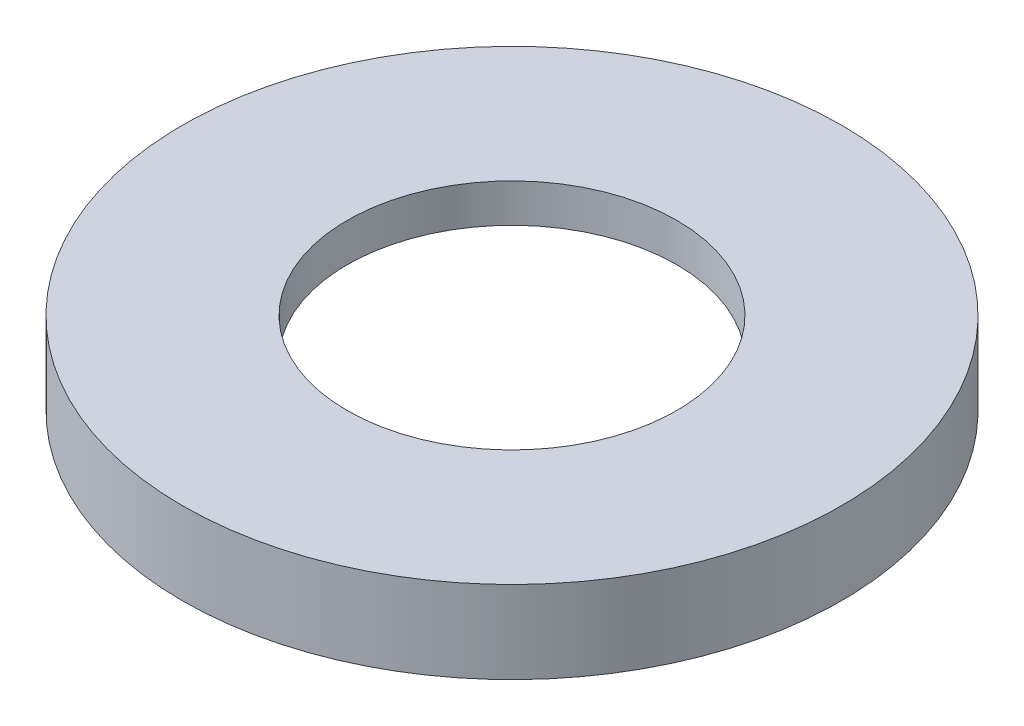
ISO-10303-21;
HEADER;
FILE_DESCRIPTION(('STEP AP214'),'2;1');
FILE_NAME('part.step','',(''),(''),'','','');
FILE_SCHEMA(('AUTOMOTIVE_DESIGN { 1 0 10303 214 1 1 1 1 }'));
ENDSEC;
DATA;
#1=APPLICATION_CONTEXT('core data for automotive mechanical design processes');
#2=APPLICATION_PROTOCOL_DEFINITION('international standard','automotive_design',2000,#1);
#3=PRODUCT_CONTEXT('',#1,'mechanical');
#4=PRODUCT('Part','Part','',(#3));
#5=PRODUCT_RELATED_PRODUCT_CATEGORY('part','',(#4));
#6=PRODUCT_DEFINITION_FORMATION('','',#4);
#7=PRODUCT_DEFINITION_CONTEXT('part definition',#1,'design');
#8=PRODUCT_DEFINITION('design','',#6,#7);
#9=PRODUCT_DEFINITION_SHAPE('','',#8);
#10=(LENGTH_UNIT() NAMED_UNIT(*) SI_UNIT(.MILLI.,.METRE.));
#11=(NAMED_UNIT(*) PLANE_ANGLE_UNIT() SI_UNIT($,.RADIAN.));
#12=(NAMED_UNIT(*) SI_UNIT($,.STERADIAN.) SOLID_ANGLE_UNIT());
#13=UNCERTAINTY_MEASURE_WITH_UNIT(LENGTH_MEASURE(1.E-05),#10,'distance_accuracy_value','');
#14=(GEOMETRIC_REPRESENTATION_CONTEXT(3) GLOBAL_UNCERTAINTY_ASSIGNED_CONTEXT((#13)) GLOBAL_UNIT_ASSIGNED_CONTEXT((#10,
#11,#12)) REPRESENTATION_CONTEXT('',''));
#15=CARTESIAN_POINT('',(0.,0.,0.));
#16=DIRECTION('',(0.,0.,1.));
#17=DIRECTION('',(1.,0.,0.));
#18=AXIS2_PLACEMENT_3D('',#15,#16,#17);
#19=CARTESIAN_POINT('',(0.,-462.696595862338,-1.58716453474464E-12));
#20=DIRECTION('',(0.,-1.,0.));
#21=DIRECTION('',(0.,0.,-1.));
#22=AXIS2_PLACEMENT_3D('',#19,#20,#21);
#23=CYLINDRICAL_SURFACE('',#22,7.50000000000001);
#24=CARTESIAN_POINT('',(0.,-1.18859649122804,0.));
#25=DIRECTION('',(0.,-1.,0.));
#26=DIRECTION('',(0.,0.,-1.));
#27=AXIS2_PLACEMENT_3D('',#24,#25,#26);
#28=CIRCLE('',#27,7.5);
#29=CARTESIAN_POINT('',(0.,-1.18859649122802,-7.50000000000001));
#30=VERTEX_POINT('',#29);
#31=EDGE_CURVE('E10',#30,#30,#28,.T.);
#32=ORIENTED_EDGE('',*,*,#31,.F.);
#33=EDGE_LOOP('',(#32));
#34=FACE_BOUND('',#33,.T.);
#35=CARTESIAN_POINT('',(0.,-2.93859649122807,0.));
#36=DIRECTION('',(0.,-1.,0.));
#37=DIRECTION('',(0.,0.,-1.));
#38=AXIS2_PLACEMENT_3D('',#35,#36,#37);
#39=CIRCLE('',#38,7.50000000000001);
#40=CARTESIAN_POINT('',(0.,-2.93859649122805,-7.50000000000002));
#41=VERTEX_POINT('',#40);
#42=EDGE_CURVE('E53',#41,#41,#39,.T.);
#43=ORIENTED_EDGE('',*,*,#42,.T.);
#44=EDGE_LOOP('',(#43));
#45=FACE_BOUND('',#44,.T.);
#46=ADVANCED_FACE('F31',(#34,#45),#23,.F.);
#47=CARTESIAN_POINT('',(0.,-1.18859649122808,15.));
#48=DIRECTION('',(0.,-1.,0.));
#49=DIRECTION('',(0.,0.,-1.));
#50=AXIS2_PLACEMENT_3D('',#47,#48,#49);
#51=PLANE('',#50);
#52=CARTESIAN_POINT('',(0.,-1.18859649122799,0.));
#53=DIRECTION('',(0.,-1.,0.));
#54=DIRECTION('',(0.,0.,-1.));
#55=AXIS2_PLACEMENT_3D('',#52,#53,#54);
#56=CIRCLE('',#55,15.);
#57=CARTESIAN_POINT('',(0.,-1.18859649122794,-15.));
#58=VERTEX_POINT('',#57);
#59=EDGE_CURVE('E37',#58,#58,#56,.T.);
#60=ORIENTED_EDGE('',*,*,#59,.F.);
#61=EDGE_LOOP('',(#60));
#62=FACE_BOUND('',#61,.T.);
#63=ORIENTED_EDGE('',*,*,#31,.T.);
#64=EDGE_LOOP('',(#63));
#65=FACE_BOUND('',#64,.T.);
#66=ADVANCED_FACE('F78',(#62,#65),#51,.F.);
#67=CARTESIAN_POINT('',(0.,-462.696595862338,-1.58716453474464E-12));
#68=DIRECTION('',(0.,-1.,0.));
#69=DIRECTION('',(0.,0.,-1.));
#70=AXIS2_PLACEMENT_3D('',#67,#68,#69);
#71=CYLINDRICAL_SURFACE('',#70,15.);
#72=CARTESIAN_POINT('',(0.,-4.93859649122802,0.));
#73=DIRECTION('',(0.,-1.,0.));
#74=DIRECTION('',(0.,0.,-1.));
#75=AXIS2_PLACEMENT_3D('',#72,#73,#74);
#76=CIRCLE('',#75,15.);
#77=CARTESIAN_POINT('',(0.,-4.93859649122797,-15.));
#78=VERTEX_POINT('',#77);
#79=EDGE_CURVE('E41',#78,#78,#76,.T.);
#80=ORIENTED_EDGE('',*,*,#79,.F.);
#81=EDGE_LOOP('',(#80));
#82=FACE_BOUND('',#81,.T.);
#83=ORIENTED_EDGE('',*,*,#59,.T.);
#84=EDGE_LOOP('',(#83));
#85=FACE_BOUND('',#84,.T.);
#86=ADVANCED_FACE('F73',(#82,#85),#71,.T.);
#87=CARTESIAN_POINT('',(0.,-4.93859649122807,15.));
#88=DIRECTION('',(0.,1.,0.));
#89=DIRECTION('',(0.,0.,1.));
#90=AXIS2_PLACEMENT_3D('',#87,#88,#89);
#91=PLANE('',#90);
#92=CARTESIAN_POINT('',(0.,-4.93859649122802,0.));
#93=DIRECTION('',(0.,-1.,0.));
#94=DIRECTION('',(0.,0.,-1.));
#95=AXIS2_PLACEMENT_3D('',#92,#93,#94);
#96=CIRCLE('',#95,11.25);
#97=CARTESIAN_POINT('',(0.,-4.93859649122798,-11.25));
#98=VERTEX_POINT('',#97);
#99=EDGE_CURVE('E45',#98,#98,#96,.T.);
#100=ORIENTED_EDGE('',*,*,#99,.F.);
#101=EDGE_LOOP('',(#100));
#102=FACE_BOUND('',#101,.T.);
#103=ORIENTED_EDGE('',*,*,#79,.T.);
#104=EDGE_LOOP('',(#103));
#105=FACE_BOUND('',#104,.T.);
#106=ADVANCED_FACE('F67',(#102,#105),#91,.F.);
#107=CARTESIAN_POINT('',(0.,-462.696595862338,-1.58716453474464E-12));
#108=DIRECTION('',(0.,-1.,0.));
#109=DIRECTION('',(0.,0.,-1.));
#110=AXIS2_PLACEMENT_3D('',#107,#108,#109);
#111=CYLINDRICAL_SURFACE('',#110,11.25);
#112=CARTESIAN_POINT('',(0.,-2.93859649122802,0.));
#113=DIRECTION('',(0.,-1.,0.));
#114=DIRECTION('',(0.,0.,-1.));
#115=AXIS2_PLACEMENT_3D('',#112,#113,#114);
#116=CIRCLE('',#115,11.25);
#117=CARTESIAN_POINT('',(0.,-2.93859649122798,-11.25));
#118=VERTEX_POINT('',#117);
#119=EDGE_CURVE('E50',#118,#118,#116,.T.);
#120=ORIENTED_EDGE('',*,*,#119,.F.);
#121=EDGE_LOOP('',(#120));
#122=FACE_BOUND('',#121,.T.);
#123=ORIENTED_EDGE('',*,*,#99,.T.);
#124=EDGE_LOOP('',(#123));
#125=FACE_BOUND('',#124,.T.);
#126=ADVANCED_FACE('F61',(#122,#125),#111,.F.);
#127=CARTESIAN_POINT('',(0.,-2.93859649122807,11.25));
#128=DIRECTION('',(0.,1.,0.));
#129=DIRECTION('',(0.,0.,1.));
#130=AXIS2_PLACEMENT_3D('',#127,#128,#129);
#131=PLANE('',#130);
#132=ORIENTED_EDGE('',*,*,#42,.F.);
#133=EDGE_LOOP('',(#132));
#134=FACE_BOUND('',#133,.T.);
#135=ORIENTED_EDGE('',*,*,#119,.T.);
#136=EDGE_LOOP('',(#135));
#137=FACE_BOUND('',#136,.T.);
#138=ADVANCED_FACE('F58',(#134,#137),#131,.F.);
#139=CLOSED_SHELL('',(#46,#66,#86,#106,#126,#138));
#140=MANIFOLD_SOLID_BREP('B2',#139);
#141=ADVANCED_BREP_SHAPE_REPRESENTATION('',(#18,#140),#14);
#142=SHAPE_DEFINITION_REPRESENTATION(#9,#141);
ENDSEC;
END-ISO-10303-21;
